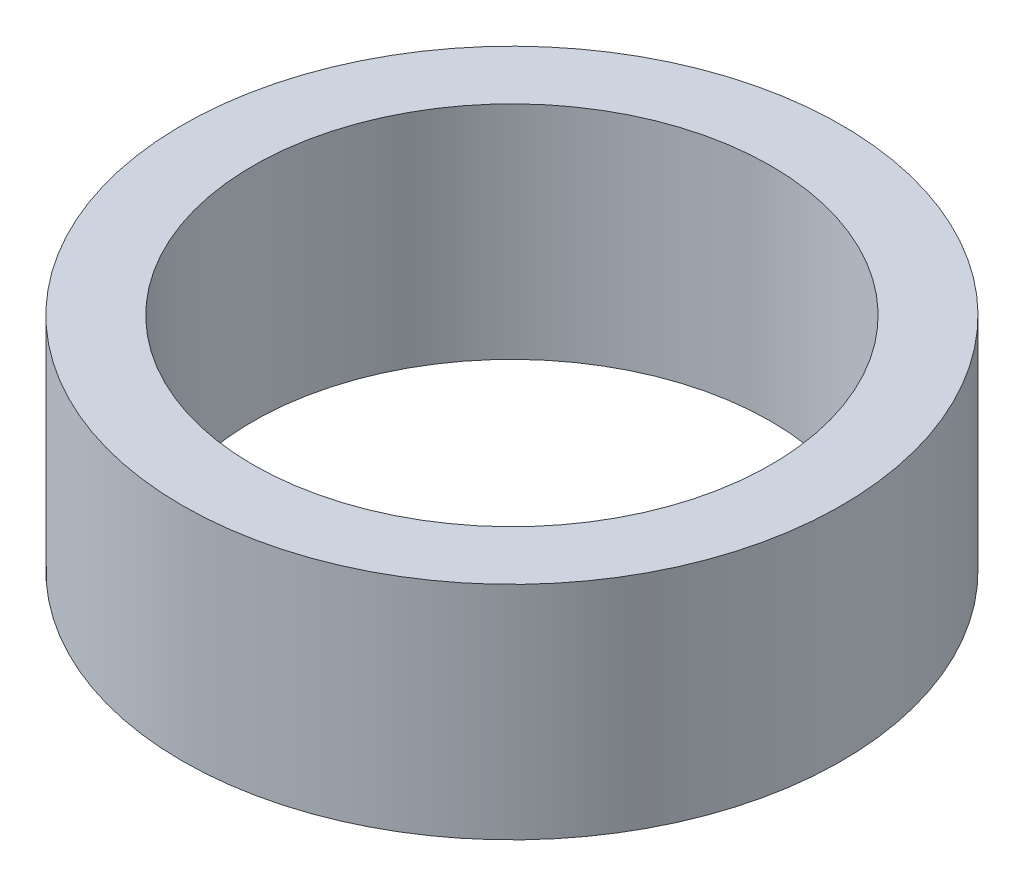
ISO-10303-21;
HEADER;
FILE_DESCRIPTION(('STEP AP214'),'2;1');
FILE_NAME('part.step','',(''),(''),'','','');
FILE_SCHEMA(('AUTOMOTIVE_DESIGN { 1 0 10303 214 1 1 1 1 }'));
ENDSEC;
DATA;
#1=APPLICATION_CONTEXT('core data for automotive mechanical design processes');
#2=APPLICATION_PROTOCOL_DEFINITION('international standard','automotive_design',2000,#1);
#3=PRODUCT_CONTEXT('',#1,'mechanical');
#4=PRODUCT('Part','Part','',(#3));
#5=PRODUCT_RELATED_PRODUCT_CATEGORY('part','',(#4));
#6=PRODUCT_DEFINITION_FORMATION('','',#4);
#7=PRODUCT_DEFINITION_CONTEXT('part definition',#1,'design');
#8=PRODUCT_DEFINITION('design','',#6,#7);
#9=PRODUCT_DEFINITION_SHAPE('','',#8);
#10=(LENGTH_UNIT() NAMED_UNIT(*) SI_UNIT(.MILLI.,.METRE.));
#11=(NAMED_UNIT(*) PLANE_ANGLE_UNIT() SI_UNIT($,.RADIAN.));
#12=(NAMED_UNIT(*) SI_UNIT($,.STERADIAN.) SOLID_ANGLE_UNIT());
#13=UNCERTAINTY_MEASURE_WITH_UNIT(LENGTH_MEASURE(1.E-05),#10,'distance_accuracy_value','');
#14=(GEOMETRIC_REPRESENTATION_CONTEXT(3) GLOBAL_UNCERTAINTY_ASSIGNED_CONTEXT((#13)) GLOBAL_UNIT_ASSIGNED_CONTEXT((#10,
#11,#12)) REPRESENTATION_CONTEXT('',''));
#15=CARTESIAN_POINT('',(0.,0.,0.));
#16=DIRECTION('',(0.,0.,1.));
#17=DIRECTION('',(1.,0.,0.));
#18=AXIS2_PLACEMENT_3D('',#15,#16,#17);
#19=CARTESIAN_POINT('',(0.,2.35,0.));
#20=DIRECTION('',(0.,1.,0.));
#21=DIRECTION('',(0.,0.,1.));
#22=AXIS2_PLACEMENT_3D('',#19,#20,#21);
#23=PLANE('',#22);
#24=CARTESIAN_POINT('',(0.,2.35,0.));
#25=DIRECTION('',(0.,1.,0.));
#26=DIRECTION('',(0.,0.,1.));
#27=AXIS2_PLACEMENT_3D('',#24,#25,#26);
#28=CIRCLE('',#27,3.5);
#29=CARTESIAN_POINT('',(0.,2.35,3.5));
#30=VERTEX_POINT('',#29);
#31=EDGE_CURVE('E10',#30,#30,#28,.T.);
#32=ORIENTED_EDGE('',*,*,#31,.T.);
#33=EDGE_LOOP('',(#32));
#34=FACE_BOUND('',#33,.T.);
#35=CARTESIAN_POINT('',(0.,2.35,0.));
#36=DIRECTION('',(0.,1.,0.));
#37=DIRECTION('',(0.,0.,1.));
#38=AXIS2_PLACEMENT_3D('',#35,#36,#37);
#39=CIRCLE('',#38,2.75);
#40=CARTESIAN_POINT('',(0.,2.35,2.75));
#41=VERTEX_POINT('',#40);
#42=EDGE_CURVE('E50',#41,#41,#39,.T.);
#43=ORIENTED_EDGE('',*,*,#42,.F.);
#44=EDGE_LOOP('',(#43));
#45=FACE_BOUND('',#44,.T.);
#46=ADVANCED_FACE('F39',(#34,#45),#23,.T.);
#47=CARTESIAN_POINT('',(0.,0.,0.));
#48=DIRECTION('',(0.,1.,0.));
#49=DIRECTION('',(0.,0.,1.));
#50=AXIS2_PLACEMENT_3D('',#47,#48,#49);
#51=PLANE('',#50);
#52=CARTESIAN_POINT('',(0.,0.,0.));
#53=DIRECTION('',(0.,1.,0.));
#54=DIRECTION('',(0.,0.,1.));
#55=AXIS2_PLACEMENT_3D('',#52,#53,#54);
#56=CIRCLE('',#55,3.5);
#57=CARTESIAN_POINT('',(0.,0.,3.5));
#58=VERTEX_POINT('',#57);
#59=EDGE_CURVE('E43',#58,#58,#56,.T.);
#60=ORIENTED_EDGE('',*,*,#59,.F.);
#61=EDGE_LOOP('',(#60));
#62=FACE_BOUND('',#61,.T.);
#63=CARTESIAN_POINT('',(0.,0.,0.));
#64=DIRECTION('',(0.,1.,0.));
#65=DIRECTION('',(0.,0.,1.));
#66=AXIS2_PLACEMENT_3D('',#63,#64,#65);
#67=CIRCLE('',#66,2.75);
#68=CARTESIAN_POINT('',(0.,0.,2.75));
#69=VERTEX_POINT('',#68);
#70=EDGE_CURVE('E52',#69,#69,#67,.T.);
#71=ORIENTED_EDGE('',*,*,#70,.T.);
#72=EDGE_LOOP('',(#71));
#73=FACE_BOUND('',#72,.T.);
#74=ADVANCED_FACE('F62',(#62,#73),#51,.F.);
#75=CARTESIAN_POINT('',(0.,2.35,0.));
#76=DIRECTION('',(0.,-1.,0.));
#77=DIRECTION('',(0.,0.,-1.));
#78=AXIS2_PLACEMENT_3D('',#75,#76,#77);
#79=CYLINDRICAL_SURFACE('',#78,3.5);
#80=ORIENTED_EDGE('',*,*,#31,.F.);
#81=EDGE_LOOP('',(#80));
#82=FACE_BOUND('',#81,.T.);
#83=ORIENTED_EDGE('',*,*,#59,.T.);
#84=EDGE_LOOP('',(#83));
#85=FACE_BOUND('',#84,.T.);
#86=ADVANCED_FACE('F41',(#82,#85),#79,.T.);
#87=CARTESIAN_POINT('',(0.,2.35,0.));
#88=DIRECTION('',(0.,-1.,0.));
#89=DIRECTION('',(0.,0.,-1.));
#90=AXIS2_PLACEMENT_3D('',#87,#88,#89);
#91=CYLINDRICAL_SURFACE('',#90,2.75);
#92=ORIENTED_EDGE('',*,*,#42,.T.);
#93=EDGE_LOOP('',(#92));
#94=FACE_BOUND('',#93,.T.);
#95=ORIENTED_EDGE('',*,*,#70,.F.);
#96=EDGE_LOOP('',(#95));
#97=FACE_BOUND('',#96,.T.);
#98=ADVANCED_FACE('F58',(#94,#97),#91,.F.);
#99=CLOSED_SHELL('',(#46,#74,#86,#98));
#100=MANIFOLD_SOLID_BREP('B2',#99);
#101=ADVANCED_BREP_SHAPE_REPRESENTATION('',(#18,#100),#14);
#102=SHAPE_DEFINITION_REPRESENTATION(#9,#101);
ENDSEC;
END-ISO-10303-21;
